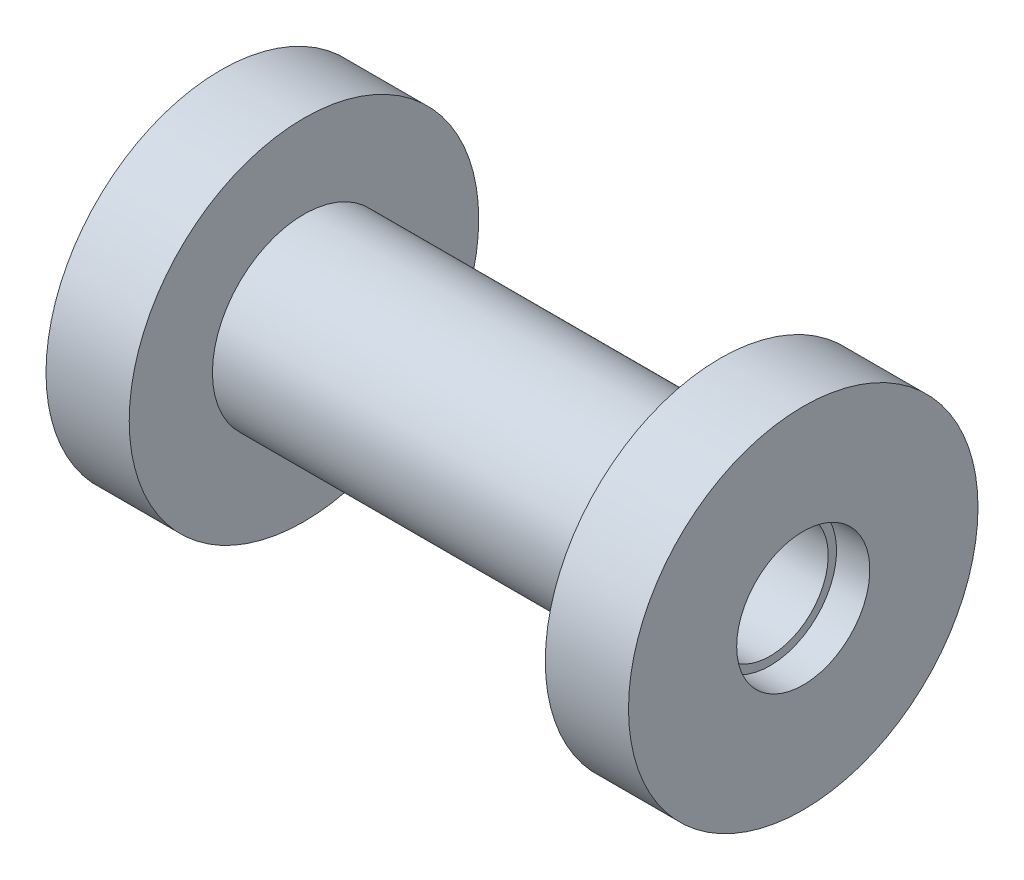
ISO-10303-21;
HEADER;
FILE_DESCRIPTION(('STEP AP214'),'2;1');
FILE_NAME('part.step','',(''),(''),'','','');
FILE_SCHEMA(('AUTOMOTIVE_DESIGN { 1 0 10303 214 1 1 1 1 }'));
ENDSEC;
DATA;
#1=APPLICATION_CONTEXT('core data for automotive mechanical design processes');
#2=APPLICATION_PROTOCOL_DEFINITION('international standard','automotive_design',2000,#1);
#3=PRODUCT_CONTEXT('',#1,'mechanical');
#4=PRODUCT('Part','Part','',(#3));
#5=PRODUCT_RELATED_PRODUCT_CATEGORY('part','',(#4));
#6=PRODUCT_DEFINITION_FORMATION('','',#4);
#7=PRODUCT_DEFINITION_CONTEXT('part definition',#1,'design');
#8=PRODUCT_DEFINITION('design','',#6,#7);
#9=PRODUCT_DEFINITION_SHAPE('','',#8);
#10=(LENGTH_UNIT() NAMED_UNIT(*) SI_UNIT(.MILLI.,.METRE.));
#11=(NAMED_UNIT(*) PLANE_ANGLE_UNIT() SI_UNIT($,.RADIAN.));
#12=(NAMED_UNIT(*) SI_UNIT($,.STERADIAN.) SOLID_ANGLE_UNIT());
#13=UNCERTAINTY_MEASURE_WITH_UNIT(LENGTH_MEASURE(1.E-05),#10,'distance_accuracy_value','');
#14=(GEOMETRIC_REPRESENTATION_CONTEXT(3) GLOBAL_UNCERTAINTY_ASSIGNED_CONTEXT((#13)) GLOBAL_UNIT_ASSIGNED_CONTEXT((#10,
#11,#12)) REPRESENTATION_CONTEXT('',''));
#15=CARTESIAN_POINT('',(0.,0.,0.));
#16=DIRECTION('',(0.,0.,1.));
#17=DIRECTION('',(1.,0.,0.));
#18=AXIS2_PLACEMENT_3D('',#15,#16,#17);
#19=CARTESIAN_POINT('',(66.,0.,0.));
#20=DIRECTION('',(-1.,0.,0.));
#21=DIRECTION('',(0.,0.,1.));
#22=AXIS2_PLACEMENT_3D('',#19,#20,#21);
#23=PLANE('',#22);
#24=CARTESIAN_POINT('',(66.,0.,0.));
#25=DIRECTION('',(-1.,0.,0.));
#26=DIRECTION('',(0.,0.,1.));
#27=AXIS2_PLACEMENT_3D('',#24,#25,#26);
#28=CIRCLE('',#27,8.);
#29=CARTESIAN_POINT('',(66.,0.,8.));
#30=VERTEX_POINT('',#29);
#31=EDGE_CURVE('E10',#30,#30,#28,.T.);
#32=ORIENTED_EDGE('',*,*,#31,.F.);
#33=EDGE_LOOP('',(#32));
#34=FACE_BOUND('',#33,.T.);
#35=CARTESIAN_POINT('',(66.,0.,0.));
#36=DIRECTION('',(-1.,0.,0.));
#37=DIRECTION('',(0.,0.,1.));
#38=AXIS2_PLACEMENT_3D('',#35,#36,#37);
#39=CIRCLE('',#38,7.);
#40=CARTESIAN_POINT('',(66.,0.,7.));
#41=VERTEX_POINT('',#40);
#42=EDGE_CURVE('E73',#41,#41,#39,.T.);
#43=ORIENTED_EDGE('',*,*,#42,.T.);
#44=EDGE_LOOP('',(#43));
#45=FACE_BOUND('',#44,.T.);
#46=ADVANCED_FACE('F33',(#34,#45),#23,.F.);
#47=CARTESIAN_POINT('',(-74.5155414447995,0.,0.));
#48=DIRECTION('',(-1.,0.,0.));
#49=DIRECTION('',(0.,0.,1.));
#50=AXIS2_PLACEMENT_3D('',#47,#48,#49);
#51=CYLINDRICAL_SURFACE('',#50,8.);
#52=CARTESIAN_POINT('',(70.,0.,0.));
#53=DIRECTION('',(-1.,0.,0.));
#54=DIRECTION('',(0.,0.,1.));
#55=AXIS2_PLACEMENT_3D('',#52,#53,#54);
#56=CIRCLE('',#55,8.);
#57=CARTESIAN_POINT('',(70.,0.,8.));
#58=VERTEX_POINT('',#57);
#59=EDGE_CURVE('E39',#58,#58,#56,.T.);
#60=ORIENTED_EDGE('',*,*,#59,.F.);
#61=EDGE_LOOP('',(#60));
#62=FACE_BOUND('',#61,.T.);
#63=ORIENTED_EDGE('',*,*,#31,.T.);
#64=EDGE_LOOP('',(#63));
#65=FACE_BOUND('',#64,.T.);
#66=ADVANCED_FACE('F108',(#62,#65),#51,.F.);
#67=CARTESIAN_POINT('',(70.,0.,0.));
#68=DIRECTION('',(1.,0.,0.));
#69=DIRECTION('',(0.,0.,-1.));
#70=AXIS2_PLACEMENT_3D('',#67,#68,#69);
#71=PLANE('',#70);
#72=ORIENTED_EDGE('',*,*,#59,.T.);
#73=EDGE_LOOP('',(#72));
#74=FACE_BOUND('',#73,.T.);
#75=CARTESIAN_POINT('',(70.,0.,0.));
#76=DIRECTION('',(-1.,0.,0.));
#77=DIRECTION('',(0.,0.,1.));
#78=AXIS2_PLACEMENT_3D('',#75,#76,#77);
#79=CIRCLE('',#78,21.);
#80=CARTESIAN_POINT('',(70.,0.,21.));
#81=VERTEX_POINT('',#80);
#82=EDGE_CURVE('E43',#81,#81,#79,.T.);
#83=ORIENTED_EDGE('',*,*,#82,.F.);
#84=EDGE_LOOP('',(#83));
#85=FACE_BOUND('',#84,.T.);
#86=ADVANCED_FACE('F113',(#74,#85),#71,.T.);
#87=CARTESIAN_POINT('',(-74.5155414447995,0.,0.));
#88=DIRECTION('',(-1.,0.,0.));
#89=DIRECTION('',(0.,0.,1.));
#90=AXIS2_PLACEMENT_3D('',#87,#88,#89);
#91=CYLINDRICAL_SURFACE('',#90,21.);
#92=ORIENTED_EDGE('',*,*,#82,.T.);
#93=EDGE_LOOP('',(#92));
#94=FACE_BOUND('',#93,.T.);
#95=CARTESIAN_POINT('',(60.,0.,0.));
#96=DIRECTION('',(-1.,0.,0.));
#97=DIRECTION('',(0.,0.,1.));
#98=AXIS2_PLACEMENT_3D('',#95,#96,#97);
#99=CIRCLE('',#98,21.);
#100=CARTESIAN_POINT('',(60.,0.,21.));
#101=VERTEX_POINT('',#100);
#102=EDGE_CURVE('E47',#101,#101,#99,.T.);
#103=ORIENTED_EDGE('',*,*,#102,.F.);
#104=EDGE_LOOP('',(#103));
#105=FACE_BOUND('',#104,.T.);
#106=ADVANCED_FACE('F118',(#94,#105),#91,.T.);
#107=CARTESIAN_POINT('',(60.,0.,0.));
#108=DIRECTION('',(-1.,0.,0.));
#109=DIRECTION('',(0.,0.,1.));
#110=AXIS2_PLACEMENT_3D('',#107,#108,#109);
#111=PLANE('',#110);
#112=ORIENTED_EDGE('',*,*,#102,.T.);
#113=EDGE_LOOP('',(#112));
#114=FACE_BOUND('',#113,.T.);
#115=CARTESIAN_POINT('',(60.,0.,0.));
#116=DIRECTION('',(-1.,0.,0.));
#117=DIRECTION('',(0.,0.,1.));
#118=AXIS2_PLACEMENT_3D('',#115,#116,#117);
#119=CIRCLE('',#118,11.);
#120=CARTESIAN_POINT('',(60.,0.,11.));
#121=VERTEX_POINT('',#120);
#122=EDGE_CURVE('E52',#121,#121,#119,.T.);
#123=ORIENTED_EDGE('',*,*,#122,.F.);
#124=EDGE_LOOP('',(#123));
#125=FACE_BOUND('',#124,.T.);
#126=ADVANCED_FACE('F123',(#114,#125),#111,.T.);
#127=CARTESIAN_POINT('',(-74.5155414447995,0.,0.));
#128=DIRECTION('',(-1.,0.,0.));
#129=DIRECTION('',(0.,0.,1.));
#130=AXIS2_PLACEMENT_3D('',#127,#128,#129);
#131=CYLINDRICAL_SURFACE('',#130,11.);
#132=ORIENTED_EDGE('',*,*,#122,.T.);
#133=EDGE_LOOP('',(#132));
#134=FACE_BOUND('',#133,.T.);
#135=CARTESIAN_POINT('',(10.,0.,0.));
#136=DIRECTION('',(-1.,0.,0.));
#137=DIRECTION('',(0.,0.,1.));
#138=AXIS2_PLACEMENT_3D('',#135,#136,#137);
#139=CIRCLE('',#138,11.);
#140=CARTESIAN_POINT('',(10.,0.,11.));
#141=VERTEX_POINT('',#140);
#142=EDGE_CURVE('E55',#141,#141,#139,.T.);
#143=ORIENTED_EDGE('',*,*,#142,.F.);
#144=EDGE_LOOP('',(#143));
#145=FACE_BOUND('',#144,.T.);
#146=ADVANCED_FACE('F127',(#134,#145),#131,.T.);
#147=CARTESIAN_POINT('',(10.,0.,0.));
#148=DIRECTION('',(1.,0.,0.));
#149=DIRECTION('',(0.,0.,-1.));
#150=AXIS2_PLACEMENT_3D('',#147,#148,#149);
#151=PLANE('',#150);
#152=ORIENTED_EDGE('',*,*,#142,.T.);
#153=EDGE_LOOP('',(#152));
#154=FACE_BOUND('',#153,.T.);
#155=CARTESIAN_POINT('',(10.,0.,0.));
#156=DIRECTION('',(-1.,0.,0.));
#157=DIRECTION('',(0.,0.,1.));
#158=AXIS2_PLACEMENT_3D('',#155,#156,#157);
#159=CIRCLE('',#158,21.);
#160=CARTESIAN_POINT('',(10.,0.,21.));
#161=VERTEX_POINT('',#160);
#162=EDGE_CURVE('E58',#161,#161,#159,.T.);
#163=ORIENTED_EDGE('',*,*,#162,.F.);
#164=EDGE_LOOP('',(#163));
#165=FACE_BOUND('',#164,.T.);
#166=ADVANCED_FACE('F104',(#154,#165),#151,.T.);
#167=CARTESIAN_POINT('',(-74.5155414447995,0.,0.));
#168=DIRECTION('',(-1.,0.,0.));
#169=DIRECTION('',(0.,0.,1.));
#170=AXIS2_PLACEMENT_3D('',#167,#168,#169);
#171=CYLINDRICAL_SURFACE('',#170,21.);
#172=ORIENTED_EDGE('',*,*,#162,.T.);
#173=EDGE_LOOP('',(#172));
#174=FACE_BOUND('',#173,.T.);
#175=CARTESIAN_POINT('',(0.,0.,0.));
#176=DIRECTION('',(-1.,0.,0.));
#177=DIRECTION('',(0.,0.,1.));
#178=AXIS2_PLACEMENT_3D('',#175,#176,#177);
#179=CIRCLE('',#178,21.);
#180=CARTESIAN_POINT('',(0.,0.,21.));
#181=VERTEX_POINT('',#180);
#182=EDGE_CURVE('E61',#181,#181,#179,.T.);
#183=ORIENTED_EDGE('',*,*,#182,.F.);
#184=EDGE_LOOP('',(#183));
#185=FACE_BOUND('',#184,.T.);
#186=ADVANCED_FACE('F98',(#174,#185),#171,.T.);
#187=CARTESIAN_POINT('',(0.,0.,0.));
#188=DIRECTION('',(-1.,0.,0.));
#189=DIRECTION('',(0.,0.,1.));
#190=AXIS2_PLACEMENT_3D('',#187,#188,#189);
#191=PLANE('',#190);
#192=ORIENTED_EDGE('',*,*,#182,.T.);
#193=EDGE_LOOP('',(#192));
#194=FACE_BOUND('',#193,.T.);
#195=CARTESIAN_POINT('',(0.,0.,0.));
#196=DIRECTION('',(-1.,0.,0.));
#197=DIRECTION('',(0.,0.,1.));
#198=AXIS2_PLACEMENT_3D('',#195,#196,#197);
#199=CIRCLE('',#198,8.);
#200=CARTESIAN_POINT('',(0.,0.,8.));
#201=VERTEX_POINT('',#200);
#202=EDGE_CURVE('E64',#201,#201,#199,.T.);
#203=ORIENTED_EDGE('',*,*,#202,.F.);
#204=EDGE_LOOP('',(#203));
#205=FACE_BOUND('',#204,.T.);
#206=ADVANCED_FACE('F93',(#194,#205),#191,.T.);
#207=CARTESIAN_POINT('',(-74.5155414447995,0.,0.));
#208=DIRECTION('',(-1.,0.,0.));
#209=DIRECTION('',(0.,0.,1.));
#210=AXIS2_PLACEMENT_3D('',#207,#208,#209);
#211=CYLINDRICAL_SURFACE('',#210,8.);
#212=CARTESIAN_POINT('',(4.,0.,0.));
#213=DIRECTION('',(-1.,0.,0.));
#214=DIRECTION('',(0.,0.,1.));
#215=AXIS2_PLACEMENT_3D('',#212,#213,#214);
#216=CIRCLE('',#215,8.);
#217=CARTESIAN_POINT('',(4.,0.,8.));
#218=VERTEX_POINT('',#217);
#219=EDGE_CURVE('E67',#218,#218,#216,.T.);
#220=ORIENTED_EDGE('',*,*,#219,.F.);
#221=EDGE_LOOP('',(#220));
#222=FACE_BOUND('',#221,.T.);
#223=ORIENTED_EDGE('',*,*,#202,.T.);
#224=EDGE_LOOP('',(#223));
#225=FACE_BOUND('',#224,.T.);
#226=ADVANCED_FACE('F87',(#222,#225),#211,.F.);
#227=CARTESIAN_POINT('',(4.00000000000001,0.,0.));
#228=DIRECTION('',(1.,0.,0.));
#229=DIRECTION('',(0.,0.,-1.));
#230=AXIS2_PLACEMENT_3D('',#227,#228,#229);
#231=PLANE('',#230);
#232=CARTESIAN_POINT('',(4.,0.,0.));
#233=DIRECTION('',(-1.,0.,0.));
#234=DIRECTION('',(0.,0.,1.));
#235=AXIS2_PLACEMENT_3D('',#232,#233,#234);
#236=CIRCLE('',#235,7.);
#237=CARTESIAN_POINT('',(4.,0.,7.));
#238=VERTEX_POINT('',#237);
#239=EDGE_CURVE('E70',#238,#238,#236,.T.);
#240=ORIENTED_EDGE('',*,*,#239,.F.);
#241=EDGE_LOOP('',(#240));
#242=FACE_BOUND('',#241,.T.);
#243=ORIENTED_EDGE('',*,*,#219,.T.);
#244=EDGE_LOOP('',(#243));
#245=FACE_BOUND('',#244,.T.);
#246=ADVANCED_FACE('F81',(#242,#245),#231,.F.);
#247=CARTESIAN_POINT('',(-74.5155414447995,0.,0.));
#248=DIRECTION('',(-1.,0.,0.));
#249=DIRECTION('',(0.,0.,1.));
#250=AXIS2_PLACEMENT_3D('',#247,#248,#249);
#251=CYLINDRICAL_SURFACE('',#250,7.);
#252=ORIENTED_EDGE('',*,*,#42,.F.);
#253=EDGE_LOOP('',(#252));
#254=FACE_BOUND('',#253,.T.);
#255=ORIENTED_EDGE('',*,*,#239,.T.);
#256=EDGE_LOOP('',(#255));
#257=FACE_BOUND('',#256,.T.);
#258=ADVANCED_FACE('F78',(#254,#257),#251,.F.);
#259=CLOSED_SHELL('',(#46,#66,#86,#106,#126,#146,#166,#186,#206,#226,#246,#258));
#260=MANIFOLD_SOLID_BREP('B2',#259);
#261=ADVANCED_BREP_SHAPE_REPRESENTATION('',(#18,#260),#14);
#262=SHAPE_DEFINITION_REPRESENTATION(#9,#261);
ENDSEC;
END-ISO-10303-21;
